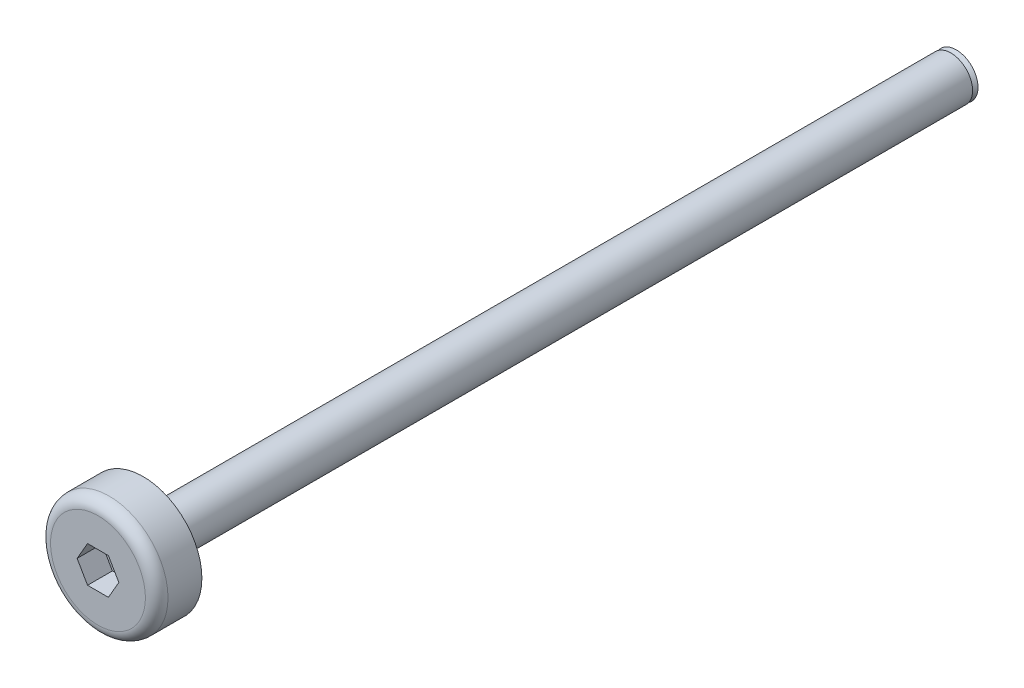
ISO-10303-21;
HEADER;
FILE_DESCRIPTION(('STEP AP214'),'2;1');
FILE_NAME('part.step','',(''),(''),'','','');
FILE_SCHEMA(('AUTOMOTIVE_DESIGN { 1 0 10303 214 1 1 1 1 }'));
ENDSEC;
DATA;
#1=APPLICATION_CONTEXT('core data for automotive mechanical design processes');
#2=APPLICATION_PROTOCOL_DEFINITION('international standard','automotive_design',2000,#1);
#3=PRODUCT_CONTEXT('',#1,'mechanical');
#4=PRODUCT('Part','Part','',(#3));
#5=PRODUCT_RELATED_PRODUCT_CATEGORY('part','',(#4));
#6=PRODUCT_DEFINITION_FORMATION('','',#4);
#7=PRODUCT_DEFINITION_CONTEXT('part definition',#1,'design');
#8=PRODUCT_DEFINITION('design','',#6,#7);
#9=PRODUCT_DEFINITION_SHAPE('','',#8);
#10=(LENGTH_UNIT() NAMED_UNIT(*) SI_UNIT(.MILLI.,.METRE.));
#11=(NAMED_UNIT(*) PLANE_ANGLE_UNIT() SI_UNIT($,.RADIAN.));
#12=(NAMED_UNIT(*) SI_UNIT($,.STERADIAN.) SOLID_ANGLE_UNIT());
#13=UNCERTAINTY_MEASURE_WITH_UNIT(LENGTH_MEASURE(1.E-05),#10,'distance_accuracy_value','');
#14=(GEOMETRIC_REPRESENTATION_CONTEXT(3) GLOBAL_UNCERTAINTY_ASSIGNED_CONTEXT((#13)) GLOBAL_UNIT_ASSIGNED_CONTEXT((#10,
#11,#12)) REPRESENTATION_CONTEXT('',''));
#15=CARTESIAN_POINT('',(0.,0.,0.));
#16=DIRECTION('',(0.,0.,1.));
#17=DIRECTION('',(1.,0.,0.));
#18=AXIS2_PLACEMENT_3D('',#15,#16,#17);
#19=CARTESIAN_POINT('',(0.,0.,-45.));
#20=DIRECTION('',(0.,0.,1.));
#21=DIRECTION('',(1.,0.,0.));
#22=AXIS2_PLACEMENT_3D('',#19,#20,#21);
#23=PLANE('',#22);
#24=CARTESIAN_POINT('',(0.,0.,-45.));
#25=DIRECTION('',(0.,0.,1.));
#26=DIRECTION('',(1.,0.,0.));
#27=AXIS2_PLACEMENT_3D('',#24,#25,#26);
#28=CIRCLE('',#27,1.2);
#29=CARTESIAN_POINT('',(1.2,0.,-45.));
#30=VERTEX_POINT('',#29);
#31=EDGE_CURVE('E9',#30,#30,#28,.T.);
#32=ORIENTED_EDGE('',*,*,#31,.F.);
#33=EDGE_LOOP('',(#32));
#34=FACE_BOUND('',#33,.T.);
#35=ADVANCED_FACE('F14',(#34),#23,.F.);
#36=CARTESIAN_POINT('',(0.,0.,-45.));
#37=DIRECTION('',(0.,0.,-1.));
#38=DIRECTION('',(1.,0.,0.));
#39=AXIS2_PLACEMENT_3D('',#36,#37,#38);
#40=CONICAL_SURFACE('',#39,1.2,0.785398163397);
#41=CARTESIAN_POINT('',(0.,0.,-44.7));
#42=DIRECTION('',(0.,0.,1.));
#43=DIRECTION('',(1.,0.,0.));
#44=AXIS2_PLACEMENT_3D('',#41,#42,#43);
#45=CIRCLE('',#44,0.9);
#46=CARTESIAN_POINT('',(0.9,0.,-44.7));
#47=VERTEX_POINT('',#46);
#48=EDGE_CURVE('E143',#47,#47,#45,.T.);
#49=ORIENTED_EDGE('',*,*,#48,.F.);
#50=DIRECTION('',(-0.707106781186548,0.,0.707106781186548));
#51=VECTOR('',#50,1.);
#52=CARTESIAN_POINT('',(1.2,0.,-45.));
#53=LINE('',#52,#51);
#54=EDGE_CURVE('E25',#30,#47,#53,.T.);
#55=ORIENTED_EDGE('',*,*,#54,.F.);
#56=ORIENTED_EDGE('',*,*,#31,.T.);
#57=ORIENTED_EDGE('',*,*,#54,.T.);
#58=EDGE_LOOP('',(#49,#55,#56,#57));
#59=FACE_BOUND('',#58,.T.);
#60=ADVANCED_FACE('F252',(#59),#40,.T.);
#61=CARTESIAN_POINT('',(0.,0.,1.125));
#62=DIRECTION('',(0.,0.,1.));
#63=DIRECTION('',(1.,0.,0.));
#64=AXIS2_PLACEMENT_3D('',#61,#62,#63);
#65=PLANE('',#64);
#66=DIRECTION('',(-0.50000000000019,0.866025403784329,0.));
#67=VECTOR('',#66,1.);
#68=CARTESIAN_POINT('',(1.154700538379,0.,1.125));
#69=LINE('',#68,#67);
#70=CARTESIAN_POINT('',(1.154700538379,0.,1.125));
#71=VERTEX_POINT('',#70);
#72=CARTESIAN_POINT('',(0.57735026919,1.,1.125));
#73=VERTEX_POINT('',#72);
#74=EDGE_CURVE('E147',#71,#73,#69,.T.);
#75=ORIENTED_EDGE('',*,*,#74,.T.);
#76=DIRECTION('',(-1.,0.,0.));
#77=VECTOR('',#76,1.);
#78=CARTESIAN_POINT('',(0.57735026919,1.,1.125));
#79=LINE('',#78,#77);
#80=CARTESIAN_POINT('',(-0.57735026919,1.,1.125));
#81=VERTEX_POINT('',#80);
#82=EDGE_CURVE('E121',#73,#81,#79,.T.);
#83=ORIENTED_EDGE('',*,*,#82,.T.);
#84=DIRECTION('',(-0.50000000000019,-0.866025403784329,0.));
#85=VECTOR('',#84,1.);
#86=CARTESIAN_POINT('',(-0.57735026919,1.,1.125));
#87=LINE('',#86,#85);
#88=CARTESIAN_POINT('',(-1.154700538379,0.,1.125));
#89=VERTEX_POINT('',#88);
#90=EDGE_CURVE('E142',#81,#89,#87,.T.);
#91=ORIENTED_EDGE('',*,*,#90,.T.);
#92=DIRECTION('',(0.50000000000019,-0.866025403784329,0.));
#93=VECTOR('',#92,1.);
#94=CARTESIAN_POINT('',(-1.154700538379,0.,1.125));
#95=LINE('',#94,#93);
#96=CARTESIAN_POINT('',(-0.57735026919,-1.,1.125));
#97=VERTEX_POINT('',#96);
#98=EDGE_CURVE('E94',#89,#97,#95,.T.);
#99=ORIENTED_EDGE('',*,*,#98,.T.);
#100=DIRECTION('',(1.,0.,0.));
#101=VECTOR('',#100,1.);
#102=CARTESIAN_POINT('',(-0.57735026919,-1.,1.125));
#103=LINE('',#102,#101);
#104=CARTESIAN_POINT('',(0.57735026919,-1.,1.125));
#105=VERTEX_POINT('',#104);
#106=EDGE_CURVE('E105',#97,#105,#103,.T.);
#107=ORIENTED_EDGE('',*,*,#106,.T.);
#108=DIRECTION('',(0.50000000000019,0.866025403784329,0.));
#109=VECTOR('',#108,1.);
#110=CARTESIAN_POINT('',(0.57735026919,-1.,1.125));
#111=LINE('',#110,#109);
#112=EDGE_CURVE('E151',#105,#71,#111,.T.);
#113=ORIENTED_EDGE('',*,*,#112,.T.);
#114=EDGE_LOOP('',(#75,#83,#91,#99,#107,#113));
#115=FACE_BOUND('',#114,.T.);
#116=ADVANCED_FACE('F218',(#115),#65,.T.);
#117=CARTESIAN_POINT('',(0.,0.,-44.7));
#118=DIRECTION('',(0.,0.,1.));
#119=DIRECTION('',(1.,0.,0.));
#120=AXIS2_PLACEMENT_3D('',#117,#118,#119);
#121=PLANE('',#120);
#122=ORIENTED_EDGE('',*,*,#48,.T.);
#123=EDGE_LOOP('',(#122));
#124=FACE_BOUND('',#123,.T.);
#125=CARTESIAN_POINT('',(0.,0.,-44.7));
#126=DIRECTION('',(0.,0.,1.));
#127=DIRECTION('',(1.,0.,0.));
#128=AXIS2_PLACEMENT_3D('',#125,#126,#127);
#129=CIRCLE('',#128,1.2);
#130=CARTESIAN_POINT('',(1.2,0.,-44.7));
#131=VERTEX_POINT('',#130);
#132=EDGE_CURVE('E114',#131,#131,#129,.T.);
#133=ORIENTED_EDGE('',*,*,#132,.F.);
#134=EDGE_LOOP('',(#133));
#135=FACE_BOUND('',#134,.T.);
#136=ADVANCED_FACE('F248',(#124,#135),#121,.F.);
#137=CARTESIAN_POINT('',(1.154700538379,0.,1.125));
#138=DIRECTION('',(-0.866025403784329,-0.50000000000019,0.));
#139=DIRECTION('',(-0.50000000000019,0.866025403784329,0.));
#140=AXIS2_PLACEMENT_3D('',#137,#138,#139);
#141=PLANE('',#140);
#142=ORIENTED_EDGE('',*,*,#74,.F.);
#143=DIRECTION('',(0.,0.,1.));
#144=VECTOR('',#143,1.);
#145=CARTESIAN_POINT('',(1.154700538379,0.,1.125));
#146=LINE('',#145,#144);
#147=CARTESIAN_POINT('',(1.154700538379,0.,2.5));
#148=VERTEX_POINT('',#147);
#149=EDGE_CURVE('E198',#71,#148,#146,.T.);
#150=ORIENTED_EDGE('',*,*,#149,.T.);
#151=DIRECTION('',(0.50000000000019,-0.866025403784329,0.));
#152=VECTOR('',#151,1.);
#153=CARTESIAN_POINT('',(1.010362971082,0.25,2.5));
#154=LINE('',#153,#152);
#155=CARTESIAN_POINT('',(0.57735026919,1.,2.5));
#156=VERTEX_POINT('',#155);
#157=EDGE_CURVE('E155',#156,#148,#154,.T.);
#158=ORIENTED_EDGE('',*,*,#157,.F.);
#159=DIRECTION('',(0.,0.,1.));
#160=VECTOR('',#159,1.);
#161=CARTESIAN_POINT('',(0.57735026919,1.,1.125));
#162=LINE('',#161,#160);
#163=EDGE_CURVE('E129',#73,#156,#162,.T.);
#164=ORIENTED_EDGE('',*,*,#163,.F.);
#165=EDGE_LOOP('',(#142,#150,#158,#164));
#166=FACE_BOUND('',#165,.T.);
#167=ADVANCED_FACE('F16',(#166),#141,.T.);
#168=CARTESIAN_POINT('',(0.57735026919,-1.,1.125));
#169=DIRECTION('',(-0.866025403784329,0.50000000000019,0.));
#170=DIRECTION('',(0.,0.,1.));
#171=AXIS2_PLACEMENT_3D('',#168,#169,#170);
#172=PLANE('',#171);
#173=ORIENTED_EDGE('',*,*,#112,.F.);
#174=DIRECTION('',(0.,0.,1.));
#175=VECTOR('',#174,1.);
#176=CARTESIAN_POINT('',(0.57735026919,-1.,1.125));
#177=LINE('',#176,#175);
#178=CARTESIAN_POINT('',(0.57735026919,-1.,2.5));
#179=VERTEX_POINT('',#178);
#180=EDGE_CURVE('E148',#105,#179,#177,.T.);
#181=ORIENTED_EDGE('',*,*,#180,.T.);
#182=DIRECTION('',(-0.50000000000019,-0.866025403784329,0.));
#183=VECTOR('',#182,1.);
#184=CARTESIAN_POINT('',(0.721687836487,-0.75,2.5));
#185=LINE('',#184,#183);
#186=EDGE_CURVE('E159',#148,#179,#185,.T.);
#187=ORIENTED_EDGE('',*,*,#186,.F.);
#188=ORIENTED_EDGE('',*,*,#149,.F.);
#189=EDGE_LOOP('',(#173,#181,#187,#188));
#190=FACE_BOUND('',#189,.T.);
#191=ADVANCED_FACE('F239',(#190),#172,.T.);
#192=CARTESIAN_POINT('',(-0.57735026919,-1.,1.125));
#193=DIRECTION('',(0.,1.,0.));
#194=DIRECTION('',(1.,0.,0.));
#195=AXIS2_PLACEMENT_3D('',#192,#193,#194);
#196=PLANE('',#195);
#197=ORIENTED_EDGE('',*,*,#106,.F.);
#198=DIRECTION('',(0.,0.,1.));
#199=VECTOR('',#198,1.);
#200=CARTESIAN_POINT('',(-0.57735026919,-1.,1.125));
#201=LINE('',#200,#199);
#202=CARTESIAN_POINT('',(-0.57735026919,-1.,2.5));
#203=VERTEX_POINT('',#202);
#204=EDGE_CURVE('E154',#97,#203,#201,.T.);
#205=ORIENTED_EDGE('',*,*,#204,.T.);
#206=DIRECTION('',(-1.,0.,0.));
#207=VECTOR('',#206,1.);
#208=CARTESIAN_POINT('',(-0.288675134595,-1.,2.5));
#209=LINE('',#208,#207);
#210=EDGE_CURVE('E186',#179,#203,#209,.T.);
#211=ORIENTED_EDGE('',*,*,#210,.F.);
#212=ORIENTED_EDGE('',*,*,#180,.F.);
#213=EDGE_LOOP('',(#197,#205,#211,#212));
#214=FACE_BOUND('',#213,.T.);
#215=ADVANCED_FACE('F236',(#214),#196,.T.);
#216=CARTESIAN_POINT('',(-1.154700538379,0.,1.125));
#217=DIRECTION('',(0.866025403784329,0.50000000000019,0.));
#218=DIRECTION('',(0.,0.,-1.));
#219=AXIS2_PLACEMENT_3D('',#216,#217,#218);
#220=PLANE('',#219);
#221=ORIENTED_EDGE('',*,*,#98,.F.);
#222=DIRECTION('',(0.,0.,1.));
#223=VECTOR('',#222,1.);
#224=CARTESIAN_POINT('',(-1.154700538379,0.,1.125));
#225=LINE('',#224,#223);
#226=CARTESIAN_POINT('',(-1.154700538379,0.,2.5));
#227=VERTEX_POINT('',#226);
#228=EDGE_CURVE('E139',#89,#227,#225,.T.);
#229=ORIENTED_EDGE('',*,*,#228,.T.);
#230=DIRECTION('',(-0.50000000000019,0.866025403784329,0.));
#231=VECTOR('',#230,1.);
#232=CARTESIAN_POINT('',(-1.010362971082,-0.25,2.5));
#233=LINE('',#232,#231);
#234=EDGE_CURVE('E168',#203,#227,#233,.T.);
#235=ORIENTED_EDGE('',*,*,#234,.F.);
#236=ORIENTED_EDGE('',*,*,#204,.F.);
#237=EDGE_LOOP('',(#221,#229,#235,#236));
#238=FACE_BOUND('',#237,.T.);
#239=ADVANCED_FACE('F235',(#238),#220,.T.);
#240=CARTESIAN_POINT('',(-0.57735026919,1.,1.125));
#241=DIRECTION('',(0.866025403784329,-0.50000000000019,0.));
#242=DIRECTION('',(0.,0.,-1.));
#243=AXIS2_PLACEMENT_3D('',#240,#241,#242);
#244=PLANE('',#243);
#245=ORIENTED_EDGE('',*,*,#90,.F.);
#246=DIRECTION('',(0.,0.,1.));
#247=VECTOR('',#246,1.);
#248=CARTESIAN_POINT('',(-0.57735026919,1.,1.125));
#249=LINE('',#248,#247);
#250=CARTESIAN_POINT('',(-0.57735026919,1.,2.5));
#251=VERTEX_POINT('',#250);
#252=EDGE_CURVE('E174',#81,#251,#249,.T.);
#253=ORIENTED_EDGE('',*,*,#252,.T.);
#254=DIRECTION('',(0.50000000000019,0.866025403784329,0.));
#255=VECTOR('',#254,1.);
#256=CARTESIAN_POINT('',(-0.721687836487,0.75,2.5));
#257=LINE('',#256,#255);
#258=EDGE_CURVE('E131',#227,#251,#257,.T.);
#259=ORIENTED_EDGE('',*,*,#258,.F.);
#260=ORIENTED_EDGE('',*,*,#228,.F.);
#261=EDGE_LOOP('',(#245,#253,#259,#260));
#262=FACE_BOUND('',#261,.T.);
#263=ADVANCED_FACE('F229',(#262),#244,.T.);
#264=CARTESIAN_POINT('',(0.57735026919,1.,1.125));
#265=DIRECTION('',(0.,-1.,0.));
#266=DIRECTION('',(-1.,0.,0.));
#267=AXIS2_PLACEMENT_3D('',#264,#265,#266);
#268=PLANE('',#267);
#269=ORIENTED_EDGE('',*,*,#82,.F.);
#270=ORIENTED_EDGE('',*,*,#163,.T.);
#271=DIRECTION('',(1.,0.,0.));
#272=VECTOR('',#271,1.);
#273=CARTESIAN_POINT('',(0.288675134595,1.,2.5));
#274=LINE('',#273,#272);
#275=EDGE_CURVE('E160',#251,#156,#274,.T.);
#276=ORIENTED_EDGE('',*,*,#275,.F.);
#277=ORIENTED_EDGE('',*,*,#252,.F.);
#278=EDGE_LOOP('',(#269,#270,#276,#277));
#279=FACE_BOUND('',#278,.T.);
#280=ADVANCED_FACE('F226',(#279),#268,.T.);
#281=CARTESIAN_POINT('',(0.,0.,-44.7));
#282=DIRECTION('',(0.,0.,1.));
#283=DIRECTION('',(1.,0.,0.));
#284=AXIS2_PLACEMENT_3D('',#281,#282,#283);
#285=CYLINDRICAL_SURFACE('',#284,1.2);
#286=CARTESIAN_POINT('',(0.,0.,0.));
#287=DIRECTION('',(0.,0.,1.));
#288=DIRECTION('',(1.,0.,0.));
#289=AXIS2_PLACEMENT_3D('',#286,#287,#288);
#290=CIRCLE('',#289,1.2);
#291=CARTESIAN_POINT('',(1.2,0.,0.));
#292=VERTEX_POINT('',#291);
#293=EDGE_CURVE('E18',#292,#292,#290,.T.);
#294=ORIENTED_EDGE('',*,*,#293,.F.);
#295=DIRECTION('',(0.,0.,1.));
#296=VECTOR('',#295,1.);
#297=CARTESIAN_POINT('',(1.2,0.,-44.7));
#298=LINE('',#297,#296);
#299=EDGE_CURVE('E117',#131,#292,#298,.T.);
#300=ORIENTED_EDGE('',*,*,#299,.F.);
#301=ORIENTED_EDGE('',*,*,#132,.T.);
#302=ORIENTED_EDGE('',*,*,#299,.T.);
#303=EDGE_LOOP('',(#294,#300,#301,#302));
#304=FACE_BOUND('',#303,.T.);
#305=ADVANCED_FACE('F116',(#304),#285,.T.);
#306=CARTESIAN_POINT('',(0.,0.,2.5));
#307=DIRECTION('',(0.,0.,1.));
#308=DIRECTION('',(1.,0.,0.));
#309=AXIS2_PLACEMENT_3D('',#306,#307,#308);
#310=PLANE('',#309);
#311=ORIENTED_EDGE('',*,*,#275,.T.);
#312=ORIENTED_EDGE('',*,*,#157,.T.);
#313=ORIENTED_EDGE('',*,*,#186,.T.);
#314=ORIENTED_EDGE('',*,*,#210,.T.);
#315=ORIENTED_EDGE('',*,*,#234,.T.);
#316=ORIENTED_EDGE('',*,*,#258,.T.);
#317=EDGE_LOOP('',(#311,#312,#313,#314,#315,#316));
#318=FACE_BOUND('',#317,.T.);
#319=CARTESIAN_POINT('',(0.,0.,2.5));
#320=DIRECTION('',(0.,0.,1.));
#321=DIRECTION('',(1.,0.,0.));
#322=AXIS2_PLACEMENT_3D('',#319,#320,#321);
#323=CIRCLE('',#322,2.625);
#324=CARTESIAN_POINT('',(2.625,0.,2.5));
#325=VERTEX_POINT('',#324);
#326=EDGE_CURVE('E175',#325,#325,#323,.T.);
#327=ORIENTED_EDGE('',*,*,#326,.T.);
#328=EDGE_LOOP('',(#327));
#329=FACE_BOUND('',#328,.T.);
#330=ADVANCED_FACE('F231',(#318,#329),#310,.T.);
#331=CARTESIAN_POINT('',(0.,0.,0.));
#332=DIRECTION('',(0.,0.,1.));
#333=DIRECTION('',(1.,0.,0.));
#334=AXIS2_PLACEMENT_3D('',#331,#332,#333);
#335=PLANE('',#334);
#336=ORIENTED_EDGE('',*,*,#293,.T.);
#337=EDGE_LOOP('',(#336));
#338=FACE_BOUND('',#337,.T.);
#339=CARTESIAN_POINT('',(0.,0.,0.));
#340=DIRECTION('',(0.,0.,1.));
#341=DIRECTION('',(1.,0.,0.));
#342=AXIS2_PLACEMENT_3D('',#339,#340,#341);
#343=CIRCLE('',#342,3.25);
#344=CARTESIAN_POINT('',(3.25,0.,0.));
#345=VERTEX_POINT('',#344);
#346=EDGE_CURVE('E134',#345,#345,#343,.T.);
#347=ORIENTED_EDGE('',*,*,#346,.F.);
#348=EDGE_LOOP('',(#347));
#349=FACE_BOUND('',#348,.T.);
#350=ADVANCED_FACE('F271',(#338,#349),#335,.F.);
#351=CARTESIAN_POINT('',(0.,0.,1.875));
#352=DIRECTION('',(0.,0.,1.));
#353=DIRECTION('',(1.,0.,0.));
#354=AXIS2_PLACEMENT_3D('',#351,#352,#353);
#355=TOROIDAL_SURFACE('',#354,2.625,0.625);
#356=CARTESIAN_POINT('',(2.625,0.,1.875));
#357=DIRECTION('',(0.,-1.,0.));
#358=DIRECTION('',(1.,0.,0.));
#359=AXIS2_PLACEMENT_3D('',#356,#357,#358);
#360=CIRCLE('',#359,0.625);
#361=CARTESIAN_POINT('',(3.25,0.,1.875));
#362=VERTEX_POINT('',#361);
#363=EDGE_CURVE('E137',#362,#325,#360,.T.);
#364=ORIENTED_EDGE('',*,*,#363,.F.);
#365=CARTESIAN_POINT('',(0.,0.,1.875));
#366=DIRECTION('',(0.,0.,1.));
#367=DIRECTION('',(1.,0.,0.));
#368=AXIS2_PLACEMENT_3D('',#365,#366,#367);
#369=CIRCLE('',#368,3.25);
#370=EDGE_CURVE('E138',#362,#362,#369,.T.);
#371=ORIENTED_EDGE('',*,*,#370,.T.);
#372=ORIENTED_EDGE('',*,*,#363,.T.);
#373=ORIENTED_EDGE('',*,*,#326,.F.);
#374=EDGE_LOOP('',(#364,#371,#372,#373));
#375=FACE_BOUND('',#374,.T.);
#376=ADVANCED_FACE('F262',(#375),#355,.T.);
#377=CARTESIAN_POINT('',(0.,0.,0.));
#378=DIRECTION('',(0.,0.,1.));
#379=DIRECTION('',(1.,0.,0.));
#380=AXIS2_PLACEMENT_3D('',#377,#378,#379);
#381=CYLINDRICAL_SURFACE('',#380,3.25);
#382=DIRECTION('',(0.,0.,1.));
#383=VECTOR('',#382,1.);
#384=CARTESIAN_POINT('',(3.25,0.,0.));
#385=LINE('',#384,#383);
#386=EDGE_CURVE('E164',#345,#362,#385,.T.);
#387=ORIENTED_EDGE('',*,*,#386,.T.);
#388=ORIENTED_EDGE('',*,*,#370,.F.);
#389=ORIENTED_EDGE('',*,*,#386,.F.);
#390=ORIENTED_EDGE('',*,*,#346,.T.);
#391=EDGE_LOOP('',(#387,#388,#389,#390));
#392=FACE_BOUND('',#391,.T.);
#393=ADVANCED_FACE('F259',(#392),#381,.T.);
#394=CLOSED_SHELL('',(#35,#60,#116,#136,#167,#191,#215,#239,#263,#280,#305,#330,#350,#376,#393));
#395=MANIFOLD_SOLID_BREP('B1',#394);
#396=ADVANCED_BREP_SHAPE_REPRESENTATION('',(#18,#395),#14);
#397=SHAPE_DEFINITION_REPRESENTATION(#9,#396);
ENDSEC;
END-ISO-10303-21;
